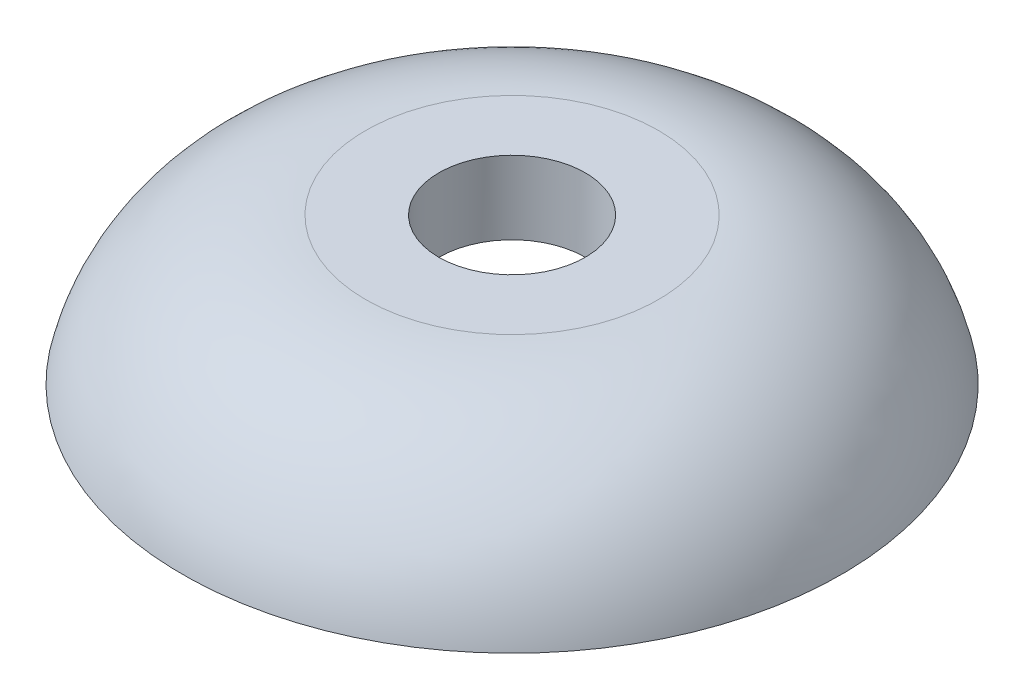
ISO-10303-21;
HEADER;
FILE_DESCRIPTION(('STEP AP214'),'2;1');
FILE_NAME('part.step','',(''),(''),'','','');
FILE_SCHEMA(('AUTOMOTIVE_DESIGN { 1 0 10303 214 1 1 1 1 }'));
ENDSEC;
DATA;
#1=APPLICATION_CONTEXT('core data for automotive mechanical design processes');
#2=APPLICATION_PROTOCOL_DEFINITION('international standard','automotive_design',2000,#1);
#3=PRODUCT_CONTEXT('',#1,'mechanical');
#4=PRODUCT('Part','Part','',(#3));
#5=PRODUCT_RELATED_PRODUCT_CATEGORY('part','',(#4));
#6=PRODUCT_DEFINITION_FORMATION('','',#4);
#7=PRODUCT_DEFINITION_CONTEXT('part definition',#1,'design');
#8=PRODUCT_DEFINITION('design','',#6,#7);
#9=PRODUCT_DEFINITION_SHAPE('','',#8);
#10=(LENGTH_UNIT() NAMED_UNIT(*) SI_UNIT(.MILLI.,.METRE.));
#11=(NAMED_UNIT(*) PLANE_ANGLE_UNIT() SI_UNIT($,.RADIAN.));
#12=(NAMED_UNIT(*) SI_UNIT($,.STERADIAN.) SOLID_ANGLE_UNIT());
#13=UNCERTAINTY_MEASURE_WITH_UNIT(LENGTH_MEASURE(1.E-05),#10,'distance_accuracy_value','');
#14=(GEOMETRIC_REPRESENTATION_CONTEXT(3) GLOBAL_UNCERTAINTY_ASSIGNED_CONTEXT((#13)) GLOBAL_UNIT_ASSIGNED_CONTEXT((#10,
#11,#12)) REPRESENTATION_CONTEXT('',''));
#15=CARTESIAN_POINT('',(0.,0.,0.));
#16=DIRECTION('',(0.,0.,1.));
#17=DIRECTION('',(1.,0.,0.));
#18=AXIS2_PLACEMENT_3D('',#15,#16,#17);
#19=CARTESIAN_POINT('',(0.,-6.,0.));
#20=DIRECTION('',(0.,1.,0.));
#21=DIRECTION('',(0.,0.,1.));
#22=AXIS2_PLACEMENT_3D('',#19,#20,#21);
#23=CYLINDRICAL_SURFACE('',#22,2.);
#24=CARTESIAN_POINT('',(0.,4.,0.));
#25=DIRECTION('',(0.,1.,0.));
#26=DIRECTION('',(0.,0.,1.));
#27=AXIS2_PLACEMENT_3D('',#24,#25,#26);
#28=CIRCLE('',#27,2.);
#29=CARTESIAN_POINT('',(0.,4.,2.));
#30=VERTEX_POINT('',#29);
#31=EDGE_CURVE('E61',#30,#30,#28,.T.);
#32=ORIENTED_EDGE('',*,*,#31,.T.);
#33=EDGE_LOOP('',(#32));
#34=FACE_BOUND('',#33,.T.);
#35=CARTESIAN_POINT('',(0.,2.,0.));
#36=DIRECTION('',(0.,-1.,0.));
#37=DIRECTION('',(0.,0.,-1.));
#38=AXIS2_PLACEMENT_3D('',#35,#36,#37);
#39=CIRCLE('',#38,2.);
#40=CARTESIAN_POINT('',(0.,2.,-2.));
#41=VERTEX_POINT('',#40);
#42=EDGE_CURVE('E58',#41,#41,#39,.F.);
#43=ORIENTED_EDGE('',*,*,#42,.F.);
#44=EDGE_LOOP('',(#43));
#45=FACE_BOUND('',#44,.T.);
#46=ADVANCED_FACE('F37',(#34,#45),#23,.F.);
#47=CARTESIAN_POINT('',(9.,0.,0.));
#48=DIRECTION('',(0.,-1.,0.));
#49=DIRECTION('',(0.,0.,-1.));
#50=AXIS2_PLACEMENT_3D('',#47,#48,#49);
#51=PLANE('',#50);
#52=CARTESIAN_POINT('',(0.,0.,0.));
#53=DIRECTION('',(0.,-1.,0.));
#54=DIRECTION('',(0.,0.,-1.));
#55=AXIS2_PLACEMENT_3D('',#52,#53,#54);
#56=CIRCLE('',#55,5.25);
#57=CARTESIAN_POINT('',(0.,0.,-5.25));
#58=VERTEX_POINT('',#57);
#59=EDGE_CURVE('E62',#58,#58,#56,.T.);
#60=ORIENTED_EDGE('',*,*,#59,.F.);
#61=EDGE_LOOP('',(#60));
#62=FACE_BOUND('',#61,.T.);
#63=CARTESIAN_POINT('',(0.,0.,0.));
#64=DIRECTION('',(0.,-1.,0.));
#65=DIRECTION('',(0.,0.,-1.));
#66=AXIS2_PLACEMENT_3D('',#63,#64,#65);
#67=CIRCLE('',#66,9.);
#68=CARTESIAN_POINT('',(0.,0.,-9.));
#69=VERTEX_POINT('',#68);
#70=EDGE_CURVE('E55',#69,#69,#67,.T.);
#71=ORIENTED_EDGE('',*,*,#70,.T.);
#72=EDGE_LOOP('',(#71));
#73=FACE_BOUND('',#72,.T.);
#74=ADVANCED_FACE('F76',(#62,#73),#51,.T.);
#75=CARTESIAN_POINT('',(0.,4.,0.));
#76=DIRECTION('',(0.,1.,0.));
#77=DIRECTION('',(0.,0.,1.));
#78=AXIS2_PLACEMENT_3D('',#75,#76,#77);
#79=PLANE('',#78);
#80=ORIENTED_EDGE('',*,*,#31,.F.);
#81=EDGE_LOOP('',(#80));
#82=FACE_BOUND('',#81,.T.);
#83=CARTESIAN_POINT('',(0.,4.,0.));
#84=DIRECTION('',(0.,-1.,0.));
#85=DIRECTION('',(0.,0.,-1.));
#86=AXIS2_PLACEMENT_3D('',#83,#84,#85);
#87=CIRCLE('',#86,4.);
#88=CARTESIAN_POINT('',(0.,4.,-4.));
#89=VERTEX_POINT('',#88);
#90=EDGE_CURVE('E50',#89,#89,#87,.T.);
#91=ORIENTED_EDGE('',*,*,#90,.F.);
#92=EDGE_LOOP('',(#91));
#93=FACE_BOUND('',#92,.T.);
#94=ADVANCED_FACE('F79',(#82,#93),#79,.T.);
#95=CARTESIAN_POINT('',(0.,-1.125,0.));
#96=DIRECTION('',(0.,-1.,0.));
#97=DIRECTION('',(0.,0.,-1.));
#98=AXIS2_PLACEMENT_3D('',#95,#96,#97);
#99=DEGENERATE_TOROIDAL_SURFACE('',#98,4.,5.125,.T.);
#100=ORIENTED_EDGE('',*,*,#90,.T.);
#101=EDGE_LOOP('',(#100));
#102=FACE_BOUND('',#101,.T.);
#103=ORIENTED_EDGE('',*,*,#70,.F.);
#104=EDGE_LOOP('',(#103));
#105=FACE_BOUND('',#104,.T.);
#106=ADVANCED_FACE('F82',(#102,#105),#99,.T.);
#107=CARTESIAN_POINT('',(0.,2.,0.));
#108=DIRECTION('',(0.,-1.,0.));
#109=DIRECTION('',(0.,0.,-1.));
#110=AXIS2_PLACEMENT_3D('',#107,#108,#109);
#111=PLANE('',#110);
#112=CARTESIAN_POINT('',(0.,2.,0.));
#113=DIRECTION('',(0.,-1.,0.));
#114=DIRECTION('',(0.,0.,-1.));
#115=AXIS2_PLACEMENT_3D('',#112,#113,#114);
#116=CIRCLE('',#115,3.75);
#117=CARTESIAN_POINT('',(0.,2.,-3.75));
#118=VERTEX_POINT('',#117);
#119=EDGE_CURVE('E45',#118,#118,#116,.T.);
#120=ORIENTED_EDGE('',*,*,#119,.T.);
#121=EDGE_LOOP('',(#120));
#122=FACE_BOUND('',#121,.T.);
#123=ORIENTED_EDGE('',*,*,#42,.T.);
#124=EDGE_LOOP('',(#123));
#125=FACE_BOUND('',#124,.T.);
#126=ADVANCED_FACE('F84',(#122,#125),#111,.T.);
#127=CARTESIAN_POINT('',(0.,2.,0.));
#128=DIRECTION('',(0.,-1.,0.));
#129=DIRECTION('',(0.,0.,-1.));
#130=AXIS2_PLACEMENT_3D('',#127,#128,#129);
#131=CYLINDRICAL_SURFACE('',#130,5.25);
#132=CARTESIAN_POINT('',(0.,0.5,0.));
#133=DIRECTION('',(0.,-1.,0.));
#134=DIRECTION('',(0.,0.,-1.));
#135=AXIS2_PLACEMENT_3D('',#132,#133,#134);
#136=CIRCLE('',#135,5.25);
#137=CARTESIAN_POINT('',(0.,0.5,-5.25));
#138=VERTEX_POINT('',#137);
#139=EDGE_CURVE('E10',#138,#138,#136,.F.);
#140=ORIENTED_EDGE('',*,*,#139,.T.);
#141=EDGE_LOOP('',(#140));
#142=FACE_BOUND('',#141,.T.);
#143=ORIENTED_EDGE('',*,*,#59,.T.);
#144=EDGE_LOOP('',(#143));
#145=FACE_BOUND('',#144,.T.);
#146=ADVANCED_FACE('F74',(#142,#145),#131,.F.);
#147=CARTESIAN_POINT('',(0.,0.5,0.));
#148=DIRECTION('',(0.,-1.,0.));
#149=DIRECTION('',(0.,0.,-1.));
#150=AXIS2_PLACEMENT_3D('',#147,#148,#149);
#151=TOROIDAL_SURFACE('',#150,3.75,1.5);
#152=ORIENTED_EDGE('',*,*,#139,.F.);
#153=EDGE_LOOP('',(#152));
#154=FACE_BOUND('',#153,.T.);
#155=ORIENTED_EDGE('',*,*,#119,.F.);
#156=EDGE_LOOP('',(#155));
#157=FACE_BOUND('',#156,.T.);
#158=ADVANCED_FACE('F39',(#154,#157),#151,.F.);
#159=CLOSED_SHELL('',(#46,#74,#94,#106,#126,#146,#158));
#160=MANIFOLD_SOLID_BREP('B2',#159);
#161=ADVANCED_BREP_SHAPE_REPRESENTATION('',(#18,#160),#14);
#162=SHAPE_DEFINITION_REPRESENTATION(#9,#161);
ENDSEC;
END-ISO-10303-21;
